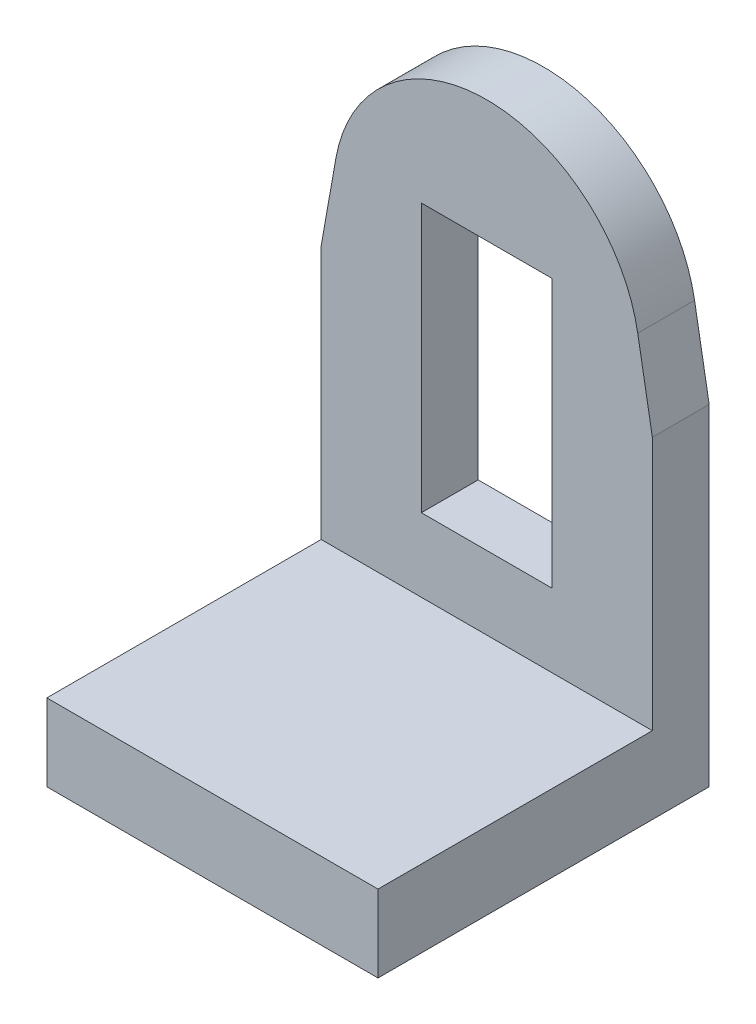
ISO-10303-21;
HEADER;
FILE_DESCRIPTION(('STEP AP214'),'2;1');
FILE_NAME('part.step','',(''),(''),'','','');
FILE_SCHEMA(('AUTOMOTIVE_DESIGN { 1 0 10303 214 1 1 1 1 }'));
ENDSEC;
DATA;
#1=APPLICATION_CONTEXT('core data for automotive mechanical design processes');
#2=APPLICATION_PROTOCOL_DEFINITION('international standard','automotive_design',2000,#1);
#3=PRODUCT_CONTEXT('',#1,'mechanical');
#4=PRODUCT('Part','Part','',(#3));
#5=PRODUCT_RELATED_PRODUCT_CATEGORY('part','',(#4));
#6=PRODUCT_DEFINITION_FORMATION('','',#4);
#7=PRODUCT_DEFINITION_CONTEXT('part definition',#1,'design');
#8=PRODUCT_DEFINITION('design','',#6,#7);
#9=PRODUCT_DEFINITION_SHAPE('','',#8);
#10=(LENGTH_UNIT() NAMED_UNIT(*) SI_UNIT(.MILLI.,.METRE.));
#11=(NAMED_UNIT(*) PLANE_ANGLE_UNIT() SI_UNIT($,.RADIAN.));
#12=(NAMED_UNIT(*) SI_UNIT($,.STERADIAN.) SOLID_ANGLE_UNIT());
#13=UNCERTAINTY_MEASURE_WITH_UNIT(LENGTH_MEASURE(1.E-05),#10,'distance_accuracy_value','');
#14=(GEOMETRIC_REPRESENTATION_CONTEXT(3) GLOBAL_UNCERTAINTY_ASSIGNED_CONTEXT((#13)) GLOBAL_UNIT_ASSIGNED_CONTEXT((#10,
#11,#12)) REPRESENTATION_CONTEXT('',''));
#15=CARTESIAN_POINT('',(0.,0.,0.));
#16=DIRECTION('',(0.,0.,1.));
#17=DIRECTION('',(1.,0.,0.));
#18=AXIS2_PLACEMENT_3D('',#15,#16,#17);
#19=CARTESIAN_POINT('',(-31.917133281993,0.,-25.4));
#20=DIRECTION('',(-1.,0.,0.));
#21=DIRECTION('',(0.,0.,1.));
#22=AXIS2_PLACEMENT_3D('',#19,#20,#21);
#23=PLANE('',#22);
#24=DIRECTION('',(0.,-1.,0.));
#25=VECTOR('',#24,1.);
#26=CARTESIAN_POINT('',(-31.917133281993,0.,-16.6825375449506));
#27=LINE('',#26,#25);
#28=CARTESIAN_POINT('',(-31.917133281993,50.8,-16.6825375449506));
#29=VERTEX_POINT('',#28);
#30=CARTESIAN_POINT('',(-31.917133281993,11.8140906450186,-16.6825375449506));
#31=VERTEX_POINT('',#30);
#32=EDGE_CURVE('E179',#29,#31,#27,.T.);
#33=ORIENTED_EDGE('',*,*,#32,.F.);
#34=DIRECTION('',(0.,0.,1.));
#35=VECTOR('',#34,1.);
#36=CARTESIAN_POINT('',(-31.917133281993,50.8,-25.4));
#37=LINE('',#36,#35);
#38=CARTESIAN_POINT('',(-31.917133281993,50.8,-25.4));
#39=VERTEX_POINT('',#38);
#40=EDGE_CURVE('E208',#39,#29,#37,.T.);
#41=ORIENTED_EDGE('',*,*,#40,.F.);
#42=DIRECTION('',(0.,-1.,0.));
#43=VECTOR('',#42,1.);
#44=CARTESIAN_POINT('',(-31.917133281993,0.,-25.4));
#45=LINE('',#44,#43);
#46=CARTESIAN_POINT('',(-31.917133281993,0.,-25.4));
#47=VERTEX_POINT('',#46);
#48=EDGE_CURVE('E189',#39,#47,#45,.T.);
#49=ORIENTED_EDGE('',*,*,#48,.T.);
#50=DIRECTION('',(0.,0.,1.));
#51=VECTOR('',#50,1.);
#52=CARTESIAN_POINT('',(-31.917133281993,0.,-25.4));
#53=LINE('',#52,#51);
#54=CARTESIAN_POINT('',(-31.917133281993,0.,25.4));
#55=VERTEX_POINT('',#54);
#56=EDGE_CURVE('E207',#47,#55,#53,.T.);
#57=ORIENTED_EDGE('',*,*,#56,.T.);
#58=DIRECTION('',(0.,-1.,0.));
#59=VECTOR('',#58,1.);
#60=CARTESIAN_POINT('',(-31.917133281993,0.,25.4));
#61=LINE('',#60,#59);
#62=CARTESIAN_POINT('',(-31.917133281993,11.8140906450186,25.4));
#63=VERTEX_POINT('',#62);
#64=EDGE_CURVE('E181',#63,#55,#61,.T.);
#65=ORIENTED_EDGE('',*,*,#64,.F.);
#66=DIRECTION('',(0.,0.,1.));
#67=VECTOR('',#66,1.);
#68=CARTESIAN_POINT('',(-31.917133281993,11.8140906450186,-25.4));
#69=LINE('',#68,#67);
#70=EDGE_CURVE('E170',#31,#63,#69,.T.);
#71=ORIENTED_EDGE('',*,*,#70,.F.);
#72=EDGE_LOOP('',(#33,#41,#49,#57,#65,#71));
#73=FACE_BOUND('',#72,.T.);
#74=ADVANCED_FACE('F41',(#73),#23,.T.);
#75=CARTESIAN_POINT('',(-31.917133281993,50.8,-25.4));
#76=DIRECTION('',(-0.984807753012208,0.173648177666931,0.));
#77=DIRECTION('',(-0.173648177666931,-0.984807753012208,0.));
#78=AXIS2_PLACEMENT_3D('',#75,#76,#77);
#79=PLANE('',#78);
#80=DIRECTION('',(-0.173648177666931,-0.984807753012208,0.));
#81=VECTOR('',#80,1.);
#82=CARTESIAN_POINT('',(-31.917133281993,50.8,-16.6825375449506));
#83=LINE('',#82,#81);
#84=CARTESIAN_POINT('',(-29.6777806269955,63.5,-16.6825375449506));
#85=VERTEX_POINT('',#84);
#86=EDGE_CURVE('E177',#85,#29,#83,.T.);
#87=ORIENTED_EDGE('',*,*,#86,.F.);
#88=DIRECTION('',(0.,0.,1.));
#89=VECTOR('',#88,1.);
#90=CARTESIAN_POINT('',(-29.6777806269955,63.5,-25.4));
#91=LINE('',#90,#89);
#92=CARTESIAN_POINT('',(-29.6777806269955,63.5,-25.4));
#93=VERTEX_POINT('',#92);
#94=EDGE_CURVE('E211',#93,#85,#91,.T.);
#95=ORIENTED_EDGE('',*,*,#94,.F.);
#96=DIRECTION('',(-0.173648177666931,-0.984807753012208,0.));
#97=VECTOR('',#96,1.);
#98=CARTESIAN_POINT('',(-31.917133281993,50.8,-25.4));
#99=LINE('',#98,#97);
#100=EDGE_CURVE('E204',#93,#39,#99,.T.);
#101=ORIENTED_EDGE('',*,*,#100,.T.);
#102=ORIENTED_EDGE('',*,*,#40,.T.);
#103=EDGE_LOOP('',(#87,#95,#101,#102));
#104=FACE_BOUND('',#103,.T.);
#105=ADVANCED_FACE('F247',(#104),#79,.T.);
#106=CARTESIAN_POINT('',(-6.51713328199305,59.4161529824022,-25.4));
#107=DIRECTION('',(0.,0.,1.));
#108=DIRECTION('',(1.,0.,0.));
#109=AXIS2_PLACEMENT_3D('',#106,#107,#108);
#110=CYLINDRICAL_SURFACE('',#109,23.5179376626164);
#111=CARTESIAN_POINT('',(-6.51713328199305,59.4161529824022,-16.6825375449506));
#112=DIRECTION('',(0.,0.,-1.));
#113=DIRECTION('',(-1.,0.,0.));
#114=AXIS2_PLACEMENT_3D('',#111,#112,#113);
#115=CIRCLE('',#114,23.5179376626164);
#116=CARTESIAN_POINT('',(16.6435140630094,63.5,-16.6825375449506));
#117=VERTEX_POINT('',#116);
#118=EDGE_CURVE('E175',#117,#85,#115,.F.);
#119=ORIENTED_EDGE('',*,*,#118,.F.);
#120=DIRECTION('',(0.,0.,1.));
#121=VECTOR('',#120,1.);
#122=CARTESIAN_POINT('',(16.6435140630094,63.5,-25.4));
#123=LINE('',#122,#121);
#124=CARTESIAN_POINT('',(16.6435140630094,63.5,-25.4));
#125=VERTEX_POINT('',#124);
#126=EDGE_CURVE('E214',#125,#117,#123,.T.);
#127=ORIENTED_EDGE('',*,*,#126,.F.);
#128=CARTESIAN_POINT('',(-6.51713328199305,59.4161529824022,-25.4));
#129=DIRECTION('',(0.,0.,1.));
#130=DIRECTION('',(-1.,0.,0.));
#131=AXIS2_PLACEMENT_3D('',#128,#129,#130);
#132=CIRCLE('',#131,23.5179376626164);
#133=EDGE_CURVE('E201',#125,#93,#132,.T.);
#134=ORIENTED_EDGE('',*,*,#133,.T.);
#135=ORIENTED_EDGE('',*,*,#94,.T.);
#136=EDGE_LOOP('',(#119,#127,#134,#135));
#137=FACE_BOUND('',#136,.T.);
#138=ADVANCED_FACE('F256',(#137),#110,.T.);
#139=CARTESIAN_POINT('',(18.882866718007,50.8,-25.4));
#140=DIRECTION('',(0.984807753012208,0.173648177666931,0.));
#141=DIRECTION('',(-0.173648177666931,0.984807753012208,0.));
#142=AXIS2_PLACEMENT_3D('',#139,#140,#141);
#143=PLANE('',#142);
#144=DIRECTION('',(-0.173648177666931,0.984807753012208,0.));
#145=VECTOR('',#144,1.);
#146=CARTESIAN_POINT('',(18.882866718007,50.8,-16.6825375449506));
#147=LINE('',#146,#145);
#148=CARTESIAN_POINT('',(18.882866718007,50.8,-16.6825375449506));
#149=VERTEX_POINT('',#148);
#150=EDGE_CURVE('E172',#149,#117,#147,.T.);
#151=ORIENTED_EDGE('',*,*,#150,.F.);
#152=DIRECTION('',(0.,0.,1.));
#153=VECTOR('',#152,1.);
#154=CARTESIAN_POINT('',(18.882866718007,50.8,-25.4));
#155=LINE('',#154,#153);
#156=CARTESIAN_POINT('',(18.882866718007,50.8,-25.4));
#157=VERTEX_POINT('',#156);
#158=EDGE_CURVE('E217',#157,#149,#155,.T.);
#159=ORIENTED_EDGE('',*,*,#158,.F.);
#160=DIRECTION('',(-0.173648177666931,0.984807753012208,0.));
#161=VECTOR('',#160,1.);
#162=CARTESIAN_POINT('',(18.882866718007,50.8,-25.4));
#163=LINE('',#162,#161);
#164=EDGE_CURVE('E198',#157,#125,#163,.T.);
#165=ORIENTED_EDGE('',*,*,#164,.T.);
#166=ORIENTED_EDGE('',*,*,#126,.T.);
#167=EDGE_LOOP('',(#151,#159,#165,#166));
#168=FACE_BOUND('',#167,.T.);
#169=ADVANCED_FACE('F254',(#168),#143,.T.);
#170=CARTESIAN_POINT('',(18.882866718007,0.,-25.4));
#171=DIRECTION('',(1.,0.,0.));
#172=DIRECTION('',(0.,0.,-1.));
#173=AXIS2_PLACEMENT_3D('',#170,#171,#172);
#174=PLANE('',#173);
#175=DIRECTION('',(0.,1.,0.));
#176=VECTOR('',#175,1.);
#177=CARTESIAN_POINT('',(18.882866718007,0.,-16.6825375449506));
#178=LINE('',#177,#176);
#179=CARTESIAN_POINT('',(18.882866718007,11.8140906450186,-16.6825375449506));
#180=VERTEX_POINT('',#179);
#181=EDGE_CURVE('E11',#180,#149,#178,.T.);
#182=ORIENTED_EDGE('',*,*,#181,.F.);
#183=DIRECTION('',(0.,0.,-1.));
#184=VECTOR('',#183,1.);
#185=CARTESIAN_POINT('',(18.882866718007,11.8140906450186,-25.4));
#186=LINE('',#185,#184);
#187=CARTESIAN_POINT('',(18.882866718007,11.8140906450186,25.4));
#188=VERTEX_POINT('',#187);
#189=EDGE_CURVE('E168',#188,#180,#186,.T.);
#190=ORIENTED_EDGE('',*,*,#189,.F.);
#191=DIRECTION('',(0.,1.,0.));
#192=VECTOR('',#191,1.);
#193=CARTESIAN_POINT('',(18.882866718007,0.,25.4));
#194=LINE('',#193,#192);
#195=CARTESIAN_POINT('',(18.882866718007,0.,25.4));
#196=VERTEX_POINT('',#195);
#197=EDGE_CURVE('E186',#196,#188,#194,.T.);
#198=ORIENTED_EDGE('',*,*,#197,.F.);
#199=DIRECTION('',(0.,0.,1.));
#200=VECTOR('',#199,1.);
#201=CARTESIAN_POINT('',(18.882866718007,0.,-25.4));
#202=LINE('',#201,#200);
#203=CARTESIAN_POINT('',(18.882866718007,0.,-25.4));
#204=VERTEX_POINT('',#203);
#205=EDGE_CURVE('E220',#204,#196,#202,.T.);
#206=ORIENTED_EDGE('',*,*,#205,.F.);
#207=DIRECTION('',(0.,1.,0.));
#208=VECTOR('',#207,1.);
#209=CARTESIAN_POINT('',(18.882866718007,0.,-25.4));
#210=LINE('',#209,#208);
#211=EDGE_CURVE('E195',#204,#157,#210,.T.);
#212=ORIENTED_EDGE('',*,*,#211,.T.);
#213=ORIENTED_EDGE('',*,*,#158,.T.);
#214=EDGE_LOOP('',(#182,#190,#198,#206,#212,#213));
#215=FACE_BOUND('',#214,.T.);
#216=ADVANCED_FACE('F240',(#215),#174,.T.);
#217=CARTESIAN_POINT('',(-31.917133281993,0.,-25.4));
#218=DIRECTION('',(0.,-1.,0.));
#219=DIRECTION('',(1.,0.,0.));
#220=AXIS2_PLACEMENT_3D('',#217,#218,#219);
#221=PLANE('',#220);
#222=ORIENTED_EDGE('',*,*,#205,.T.);
#223=DIRECTION('',(1.,0.,0.));
#224=VECTOR('',#223,1.);
#225=CARTESIAN_POINT('',(-31.917133281993,0.,25.4));
#226=LINE('',#225,#224);
#227=EDGE_CURVE('E183',#55,#196,#226,.T.);
#228=ORIENTED_EDGE('',*,*,#227,.F.);
#229=ORIENTED_EDGE('',*,*,#56,.F.);
#230=DIRECTION('',(1.,0.,0.));
#231=VECTOR('',#230,1.);
#232=CARTESIAN_POINT('',(-31.917133281993,0.,-25.4));
#233=LINE('',#232,#231);
#234=EDGE_CURVE('E192',#47,#204,#233,.T.);
#235=ORIENTED_EDGE('',*,*,#234,.T.);
#236=EDGE_LOOP('',(#222,#228,#229,#235));
#237=FACE_BOUND('',#236,.T.);
#238=ADVANCED_FACE('F237',(#237),#221,.T.);
#239=CARTESIAN_POINT('',(-6.51713328199305,59.4161529824022,-25.4));
#240=DIRECTION('',(0.,0.,-1.));
#241=DIRECTION('',(-1.,0.,0.));
#242=AXIS2_PLACEMENT_3D('',#239,#240,#241);
#243=PLANE('',#242);
#244=DIRECTION('',(0.,1.,0.));
#245=VECTOR('',#244,1.);
#246=CARTESIAN_POINT('',(3.51586671800696,23.0517928050174,-25.4));
#247=LINE('',#246,#245);
#248=CARTESIAN_POINT('',(3.51586671800696,23.0517928050174,-25.4));
#249=VERTEX_POINT('',#248);
#250=CARTESIAN_POINT('',(3.51586671800696,64.1997928050174,-25.4));
#251=VERTEX_POINT('',#250);
#252=EDGE_CURVE('E158',#249,#251,#247,.T.);
#253=ORIENTED_EDGE('',*,*,#252,.T.);
#254=DIRECTION('',(-1.,0.,0.));
#255=VECTOR('',#254,1.);
#256=CARTESIAN_POINT('',(-16.550133281993,64.1997928050174,-25.4));
#257=LINE('',#256,#255);
#258=CARTESIAN_POINT('',(-16.550133281993,64.1997928050174,-25.4));
#259=VERTEX_POINT('',#258);
#260=EDGE_CURVE('E143',#251,#259,#257,.T.);
#261=ORIENTED_EDGE('',*,*,#260,.T.);
#262=DIRECTION('',(0.,-1.,0.));
#263=VECTOR('',#262,1.);
#264=CARTESIAN_POINT('',(-16.550133281993,23.0517928050174,-25.4));
#265=LINE('',#264,#263);
#266=CARTESIAN_POINT('',(-16.550133281993,23.0517928050174,-25.4));
#267=VERTEX_POINT('',#266);
#268=EDGE_CURVE('E134',#259,#267,#265,.T.);
#269=ORIENTED_EDGE('',*,*,#268,.T.);
#270=DIRECTION('',(1.,0.,0.));
#271=VECTOR('',#270,1.);
#272=CARTESIAN_POINT('',(-16.550133281993,23.0517928050174,-25.4));
#273=LINE('',#272,#271);
#274=EDGE_CURVE('E155',#267,#249,#273,.T.);
#275=ORIENTED_EDGE('',*,*,#274,.T.);
#276=EDGE_LOOP('',(#253,#261,#269,#275));
#277=FACE_BOUND('',#276,.T.);
#278=ORIENTED_EDGE('',*,*,#48,.F.);
#279=ORIENTED_EDGE('',*,*,#100,.F.);
#280=ORIENTED_EDGE('',*,*,#133,.F.);
#281=ORIENTED_EDGE('',*,*,#164,.F.);
#282=ORIENTED_EDGE('',*,*,#211,.F.);
#283=ORIENTED_EDGE('',*,*,#234,.F.);
#284=EDGE_LOOP('',(#278,#279,#280,#281,#282,#283));
#285=FACE_BOUND('',#284,.T.);
#286=ADVANCED_FACE('F251',(#277,#285),#243,.T.);
#287=CARTESIAN_POINT('',(-6.51713328199305,59.4161529824022,25.4));
#288=DIRECTION('',(0.,0.,-1.));
#289=DIRECTION('',(-1.,0.,0.));
#290=AXIS2_PLACEMENT_3D('',#287,#288,#289);
#291=PLANE('',#290);
#292=ORIENTED_EDGE('',*,*,#197,.T.);
#293=DIRECTION('',(-1.,0.,0.));
#294=VECTOR('',#293,1.);
#295=CARTESIAN_POINT('',(-6.51713328199305,11.8140906450186,25.4));
#296=LINE('',#295,#294);
#297=EDGE_CURVE('E48',#188,#63,#296,.T.);
#298=ORIENTED_EDGE('',*,*,#297,.T.);
#299=ORIENTED_EDGE('',*,*,#64,.T.);
#300=ORIENTED_EDGE('',*,*,#227,.T.);
#301=EDGE_LOOP('',(#292,#298,#299,#300));
#302=FACE_BOUND('',#301,.T.);
#303=ADVANCED_FACE('F226',(#302),#291,.F.);
#304=CARTESIAN_POINT('',(-35.028726909861,11.8140906450186,-16.6825375449506));
#305=DIRECTION('',(0.,0.,-1.));
#306=DIRECTION('',(-1.,0.,0.));
#307=AXIS2_PLACEMENT_3D('',#304,#305,#306);
#308=PLANE('',#307);
#309=DIRECTION('',(-1.,0.,0.));
#310=VECTOR('',#309,1.);
#311=CARTESIAN_POINT('',(-16.550133281993,64.1997928050174,-16.6825375449506));
#312=LINE('',#311,#310);
#313=CARTESIAN_POINT('',(3.51586671800696,64.1997928050174,-16.6825375449506));
#314=VERTEX_POINT('',#313);
#315=CARTESIAN_POINT('',(-16.550133281993,64.1997928050174,-16.6825375449506));
#316=VERTEX_POINT('',#315);
#317=EDGE_CURVE('E140',#314,#316,#312,.T.);
#318=ORIENTED_EDGE('',*,*,#317,.F.);
#319=DIRECTION('',(0.,1.,0.));
#320=VECTOR('',#319,1.);
#321=CARTESIAN_POINT('',(3.51586671800696,23.0517928050174,-16.6825375449506));
#322=LINE('',#321,#320);
#323=CARTESIAN_POINT('',(3.51586671800696,23.0517928050174,-16.6825375449506));
#324=VERTEX_POINT('',#323);
#325=EDGE_CURVE('E63',#324,#314,#322,.T.);
#326=ORIENTED_EDGE('',*,*,#325,.F.);
#327=DIRECTION('',(1.,0.,0.));
#328=VECTOR('',#327,1.);
#329=CARTESIAN_POINT('',(-16.550133281993,23.0517928050174,-16.6825375449506));
#330=LINE('',#329,#328);
#331=CARTESIAN_POINT('',(-16.550133281993,23.0517928050174,-16.6825375449506));
#332=VERTEX_POINT('',#331);
#333=EDGE_CURVE('E149',#332,#324,#330,.T.);
#334=ORIENTED_EDGE('',*,*,#333,.F.);
#335=DIRECTION('',(0.,-1.,0.));
#336=VECTOR('',#335,1.);
#337=CARTESIAN_POINT('',(-16.550133281993,23.0517928050174,-16.6825375449506));
#338=LINE('',#337,#336);
#339=EDGE_CURVE('E131',#316,#332,#338,.T.);
#340=ORIENTED_EDGE('',*,*,#339,.F.);
#341=EDGE_LOOP('',(#318,#326,#334,#340));
#342=FACE_BOUND('',#341,.T.);
#343=ORIENTED_EDGE('',*,*,#32,.T.);
#344=DIRECTION('',(-1.,0.,0.));
#345=VECTOR('',#344,1.);
#346=CARTESIAN_POINT('',(-35.028726909861,11.8140906450186,-16.6825375449506));
#347=LINE('',#346,#345);
#348=EDGE_CURVE('E165',#180,#31,#347,.T.);
#349=ORIENTED_EDGE('',*,*,#348,.F.);
#350=ORIENTED_EDGE('',*,*,#181,.T.);
#351=ORIENTED_EDGE('',*,*,#150,.T.);
#352=ORIENTED_EDGE('',*,*,#118,.T.);
#353=ORIENTED_EDGE('',*,*,#86,.T.);
#354=EDGE_LOOP('',(#343,#349,#350,#351,#352,#353));
#355=FACE_BOUND('',#354,.T.);
#356=ADVANCED_FACE('F146',(#342,#355),#308,.F.);
#357=CARTESIAN_POINT('',(0.,11.8140906450186,0.));
#358=DIRECTION('',(0.,-1.,0.));
#359=DIRECTION('',(0.,0.,-1.));
#360=AXIS2_PLACEMENT_3D('',#357,#358,#359);
#361=PLANE('',#360);
#362=ORIENTED_EDGE('',*,*,#70,.T.);
#363=ORIENTED_EDGE('',*,*,#297,.F.);
#364=ORIENTED_EDGE('',*,*,#189,.T.);
#365=ORIENTED_EDGE('',*,*,#348,.T.);
#366=EDGE_LOOP('',(#362,#363,#364,#365));
#367=FACE_BOUND('',#366,.T.);
#368=ADVANCED_FACE('F243',(#367),#361,.F.);
#369=CARTESIAN_POINT('',(3.51586671800696,23.0517928050174,-25.401));
#370=DIRECTION('',(1.,0.,0.));
#371=DIRECTION('',(0.,0.,-1.));
#372=AXIS2_PLACEMENT_3D('',#369,#370,#371);
#373=PLANE('',#372);
#374=DIRECTION('',(0.,0.,1.));
#375=VECTOR('',#374,1.);
#376=CARTESIAN_POINT('',(3.51586671800696,23.0517928050174,-25.401));
#377=LINE('',#376,#375);
#378=EDGE_CURVE('E144',#249,#324,#377,.T.);
#379=ORIENTED_EDGE('',*,*,#378,.T.);
#380=ORIENTED_EDGE('',*,*,#325,.T.);
#381=DIRECTION('',(0.,0.,1.));
#382=VECTOR('',#381,1.);
#383=CARTESIAN_POINT('',(3.51586671800696,64.1997928050174,-25.401));
#384=LINE('',#383,#382);
#385=EDGE_CURVE('E137',#251,#314,#384,.T.);
#386=ORIENTED_EDGE('',*,*,#385,.F.);
#387=ORIENTED_EDGE('',*,*,#252,.F.);
#388=EDGE_LOOP('',(#379,#380,#386,#387));
#389=FACE_BOUND('',#388,.T.);
#390=ADVANCED_FACE('F334',(#389),#373,.F.);
#391=CARTESIAN_POINT('',(-16.550133281993,23.0517928050174,-25.401));
#392=DIRECTION('',(0.,-1.,0.));
#393=DIRECTION('',(0.,0.,-1.));
#394=AXIS2_PLACEMENT_3D('',#391,#392,#393);
#395=PLANE('',#394);
#396=DIRECTION('',(0.,0.,1.));
#397=VECTOR('',#396,1.);
#398=CARTESIAN_POINT('',(-16.550133281993,23.0517928050174,-25.401));
#399=LINE('',#398,#397);
#400=EDGE_CURVE('E136',#267,#332,#399,.T.);
#401=ORIENTED_EDGE('',*,*,#400,.T.);
#402=ORIENTED_EDGE('',*,*,#333,.T.);
#403=ORIENTED_EDGE('',*,*,#378,.F.);
#404=ORIENTED_EDGE('',*,*,#274,.F.);
#405=EDGE_LOOP('',(#401,#402,#403,#404));
#406=FACE_BOUND('',#405,.T.);
#407=ADVANCED_FACE('F342',(#406),#395,.F.);
#408=CARTESIAN_POINT('',(-16.550133281993,23.0517928050174,-25.401));
#409=DIRECTION('',(-1.,0.,0.));
#410=DIRECTION('',(0.,0.,1.));
#411=AXIS2_PLACEMENT_3D('',#408,#409,#410);
#412=PLANE('',#411);
#413=DIRECTION('',(0.,0.,1.));
#414=VECTOR('',#413,1.);
#415=CARTESIAN_POINT('',(-16.550133281993,64.1997928050174,-25.401));
#416=LINE('',#415,#414);
#417=EDGE_CURVE('E55',#259,#316,#416,.T.);
#418=ORIENTED_EDGE('',*,*,#417,.T.);
#419=ORIENTED_EDGE('',*,*,#339,.T.);
#420=ORIENTED_EDGE('',*,*,#400,.F.);
#421=ORIENTED_EDGE('',*,*,#268,.F.);
#422=EDGE_LOOP('',(#418,#419,#420,#421));
#423=FACE_BOUND('',#422,.T.);
#424=ADVANCED_FACE('F128',(#423),#412,.F.);
#425=CARTESIAN_POINT('',(-16.550133281993,64.1997928050174,-25.401));
#426=DIRECTION('',(0.,1.,0.));
#427=DIRECTION('',(0.,0.,1.));
#428=AXIS2_PLACEMENT_3D('',#425,#426,#427);
#429=PLANE('',#428);
#430=ORIENTED_EDGE('',*,*,#385,.T.);
#431=ORIENTED_EDGE('',*,*,#317,.T.);
#432=ORIENTED_EDGE('',*,*,#417,.F.);
#433=ORIENTED_EDGE('',*,*,#260,.F.);
#434=EDGE_LOOP('',(#430,#431,#432,#433));
#435=FACE_BOUND('',#434,.T.);
#436=ADVANCED_FACE('F141',(#435),#429,.F.);
#437=CLOSED_SHELL('',(#74,#105,#138,#169,#216,#238,#286,#303,#356,#368,#390,#407,#424,#436));
#438=MANIFOLD_SOLID_BREP('B2',#437);
#439=ADVANCED_BREP_SHAPE_REPRESENTATION('',(#18,#438),#14);
#440=SHAPE_DEFINITION_REPRESENTATION(#9,#439);
ENDSEC;
END-ISO-10303-21;
